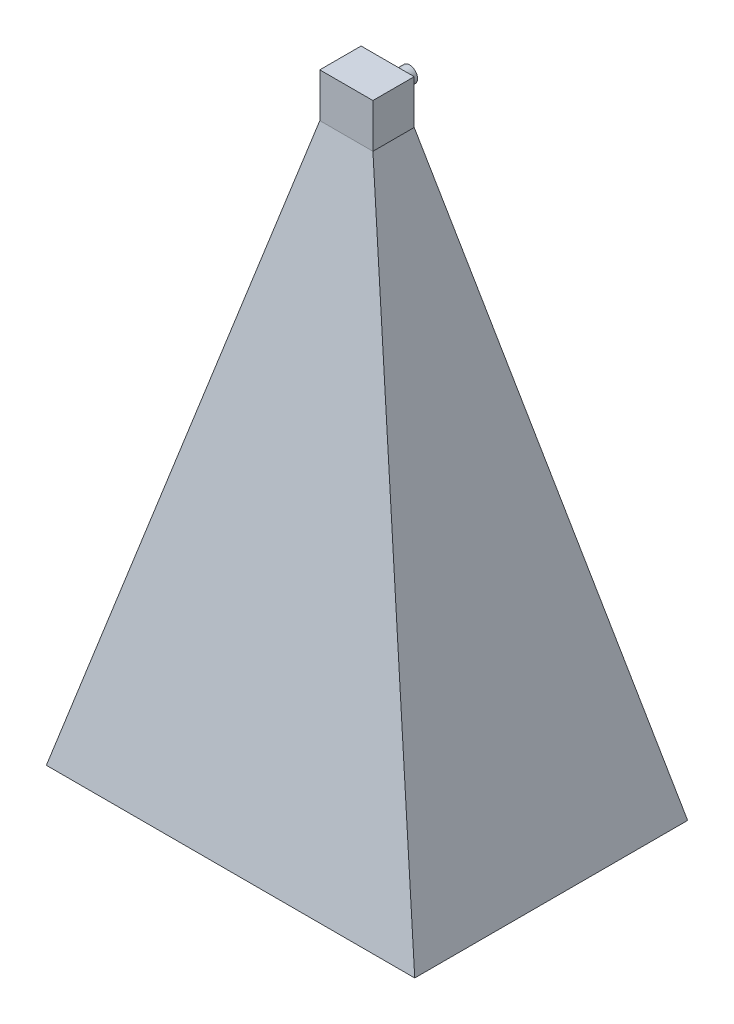
ISO-10303-21;
HEADER;
FILE_DESCRIPTION(('STEP AP214'),'2;1');
FILE_NAME('part.step','',(''),(''),'','','');
FILE_SCHEMA(('AUTOMOTIVE_DESIGN { 1 0 10303 214 1 1 1 1 }'));
ENDSEC;
DATA;
#1=APPLICATION_CONTEXT('core data for automotive mechanical design processes');
#2=APPLICATION_PROTOCOL_DEFINITION('international standard','automotive_design',2000,#1);
#3=PRODUCT_CONTEXT('',#1,'mechanical');
#4=PRODUCT('Part','Part','',(#3));
#5=PRODUCT_RELATED_PRODUCT_CATEGORY('part','',(#4));
#6=PRODUCT_DEFINITION_FORMATION('','',#4);
#7=PRODUCT_DEFINITION_CONTEXT('part definition',#1,'design');
#8=PRODUCT_DEFINITION('design','',#6,#7);
#9=PRODUCT_DEFINITION_SHAPE('','',#8);
#10=(LENGTH_UNIT() NAMED_UNIT(*) SI_UNIT(.MILLI.,.METRE.));
#11=(NAMED_UNIT(*) PLANE_ANGLE_UNIT() SI_UNIT($,.RADIAN.));
#12=(NAMED_UNIT(*) SI_UNIT($,.STERADIAN.) SOLID_ANGLE_UNIT());
#13=UNCERTAINTY_MEASURE_WITH_UNIT(LENGTH_MEASURE(1.E-05),#10,'distance_accuracy_value','');
#14=(GEOMETRIC_REPRESENTATION_CONTEXT(3) GLOBAL_UNCERTAINTY_ASSIGNED_CONTEXT((#13)) GLOBAL_UNIT_ASSIGNED_CONTEXT((#10,
#11,#12)) REPRESENTATION_CONTEXT('',''));
#15=CARTESIAN_POINT('',(0.,0.,0.));
#16=DIRECTION('',(0.,0.,1.));
#17=DIRECTION('',(1.,0.,0.));
#18=AXIS2_PLACEMENT_3D('',#15,#16,#17);
#19=CARTESIAN_POINT('',(-18.109115614425,425.,-14.0797894774487));
#20=DIRECTION('',(0.,0.,1.));
#21=DIRECTION('',(1.,0.,0.));
#22=AXIS2_PLACEMENT_3D('',#19,#20,#21);
#23=PLANE('',#22);
#24=DIRECTION('',(-1.,0.,0.));
#25=VECTOR('',#24,1.);
#26=CARTESIAN_POINT('',(-15.,395.,-14.0797894774487));
#27=LINE('',#26,#25);
#28=CARTESIAN_POINT('',(18.109115614425,395.,-14.0797894774487));
#29=VERTEX_POINT('',#28);
#30=CARTESIAN_POINT('',(-18.109115614425,395.,-14.0797894774487));
#31=VERTEX_POINT('',#30);
#32=EDGE_CURVE('E192',#29,#31,#27,.T.);
#33=ORIENTED_EDGE('',*,*,#32,.T.);
#34=DIRECTION('',(0.,-1.,0.));
#35=VECTOR('',#34,1.);
#36=CARTESIAN_POINT('',(-18.109115614425,425.,-14.0797894774487));
#37=LINE('',#36,#35);
#38=CARTESIAN_POINT('',(-18.109115614425,425.,-14.0797894774487));
#39=VERTEX_POINT('',#38);
#40=EDGE_CURVE('E308',#39,#31,#37,.T.);
#41=ORIENTED_EDGE('',*,*,#40,.F.);
#42=DIRECTION('',(-1.,0.,0.));
#43=VECTOR('',#42,1.);
#44=CARTESIAN_POINT('',(-18.109115614425,425.,-14.0797894774487));
#45=LINE('',#44,#43);
#46=CARTESIAN_POINT('',(18.109115614425,425.,-14.0797894774487));
#47=VERTEX_POINT('',#46);
#48=EDGE_CURVE('E148',#47,#39,#45,.T.);
#49=ORIENTED_EDGE('',*,*,#48,.F.);
#50=DIRECTION('',(0.,-1.,0.));
#51=VECTOR('',#50,1.);
#52=CARTESIAN_POINT('',(18.109115614425,425.,-14.0797894774487));
#53=LINE('',#52,#51);
#54=EDGE_CURVE('E160',#47,#29,#53,.T.);
#55=ORIENTED_EDGE('',*,*,#54,.T.);
#56=EDGE_LOOP('',(#33,#41,#49,#55));
#57=FACE_BOUND('',#56,.T.);
#58=CARTESIAN_POINT('',(0.,410.,-14.0797894774487));
#59=DIRECTION('',(0.,0.,1.));
#60=DIRECTION('',(1.,0.,0.));
#61=AXIS2_PLACEMENT_3D('',#58,#59,#60);
#62=CIRCLE('',#61,5.40260813746257);
#63=CARTESIAN_POINT('',(5.40260813746257,410.,-14.0797894774487));
#64=VERTEX_POINT('',#63);
#65=EDGE_CURVE('E12',#64,#64,#62,.F.);
#66=ORIENTED_EDGE('',*,*,#65,.F.);
#67=EDGE_LOOP('',(#66));
#68=FACE_BOUND('',#67,.T.);
#69=ADVANCED_FACE('F41',(#57,#68),#23,.F.);
#70=CARTESIAN_POINT('',(-122.5,0.,90.));
#71=DIRECTION('',(0.,1.,0.));
#72=DIRECTION('',(0.,0.,1.));
#73=AXIS2_PLACEMENT_3D('',#70,#71,#72);
#74=PLANE('',#73);
#75=DIRECTION('',(0.,0.,1.));
#76=VECTOR('',#75,1.);
#77=CARTESIAN_POINT('',(-125.609115614425,0.,11.0204081632654));
#78=LINE('',#77,#76);
#79=CARTESIAN_POINT('',(-125.609115614425,0.,-93.0593813141834));
#80=VERTEX_POINT('',#79);
#81=CARTESIAN_POINT('',(-125.609115614425,0.,93.0593813141834));
#82=VERTEX_POINT('',#81);
#83=EDGE_CURVE('E187',#80,#82,#78,.T.);
#84=ORIENTED_EDGE('',*,*,#83,.F.);
#85=DIRECTION('',(-1.,0.,0.));
#86=VECTOR('',#85,1.);
#87=CARTESIAN_POINT('',(-15.,0.,-93.0593813141834));
#88=LINE('',#87,#86);
#89=CARTESIAN_POINT('',(125.609115614425,0.,-93.0593813141834));
#90=VERTEX_POINT('',#89);
#91=EDGE_CURVE('E49',#90,#80,#88,.T.);
#92=ORIENTED_EDGE('',*,*,#91,.F.);
#93=DIRECTION('',(0.,0.,-1.));
#94=VECTOR('',#93,1.);
#95=CARTESIAN_POINT('',(125.609115614425,0.,-11.0204081632653));
#96=LINE('',#95,#94);
#97=CARTESIAN_POINT('',(125.609115614425,0.,93.0593813141834));
#98=VERTEX_POINT('',#97);
#99=EDGE_CURVE('E202',#98,#90,#96,.T.);
#100=ORIENTED_EDGE('',*,*,#99,.F.);
#101=DIRECTION('',(1.,0.,0.));
#102=VECTOR('',#101,1.);
#103=CARTESIAN_POINT('',(15.,0.,93.0593813141834));
#104=LINE('',#103,#102);
#105=EDGE_CURVE('E65',#82,#98,#104,.T.);
#106=ORIENTED_EDGE('',*,*,#105,.F.);
#107=EDGE_LOOP('',(#84,#92,#100,#106));
#108=FACE_BOUND('',#107,.T.);
#109=DIRECTION('',(0.,0.,1.));
#110=VECTOR('',#109,1.);
#111=CARTESIAN_POINT('',(-122.5,0.,-90.));
#112=LINE('',#111,#110);
#113=CARTESIAN_POINT('',(-122.5,0.,-90.));
#114=VERTEX_POINT('',#113);
#115=CARTESIAN_POINT('',(-122.5,0.,90.));
#116=VERTEX_POINT('',#115);
#117=EDGE_CURVE('E167',#114,#116,#112,.T.);
#118=ORIENTED_EDGE('',*,*,#117,.T.);
#119=DIRECTION('',(1.,0.,0.));
#120=VECTOR('',#119,1.);
#121=CARTESIAN_POINT('',(-122.5,0.,90.));
#122=LINE('',#121,#120);
#123=CARTESIAN_POINT('',(122.5,0.,90.));
#124=VERTEX_POINT('',#123);
#125=EDGE_CURVE('E98',#116,#124,#122,.T.);
#126=ORIENTED_EDGE('',*,*,#125,.T.);
#127=DIRECTION('',(0.,0.,-1.));
#128=VECTOR('',#127,1.);
#129=CARTESIAN_POINT('',(122.5,0.,-90.));
#130=LINE('',#129,#128);
#131=CARTESIAN_POINT('',(122.5,0.,-90.));
#132=VERTEX_POINT('',#131);
#133=EDGE_CURVE('E208',#124,#132,#130,.T.);
#134=ORIENTED_EDGE('',*,*,#133,.T.);
#135=DIRECTION('',(-1.,0.,0.));
#136=VECTOR('',#135,1.);
#137=CARTESIAN_POINT('',(-122.5,0.,-90.));
#138=LINE('',#137,#136);
#139=EDGE_CURVE('E200',#132,#114,#138,.T.);
#140=ORIENTED_EDGE('',*,*,#139,.T.);
#141=EDGE_LOOP('',(#118,#126,#134,#140));
#142=FACE_BOUND('',#141,.T.);
#143=ADVANCED_FACE('F245',(#108,#142),#74,.F.);
#144=CARTESIAN_POINT('',(-15.,395.588202260219,-13.9621794156017));
#145=DIRECTION('',(0.,-0.196067420073056,0.980590417445477));
#146=DIRECTION('',(0.,-0.980590417445478,-0.196067420073056));
#147=AXIS2_PLACEMENT_3D('',#144,#145,#146);
#148=PLANE('',#147);
#149=DIRECTION('',(0.257845649597896,0.947432852010875,0.18943762011274));
#150=VECTOR('',#149,1.);
#151=CARTESIAN_POINT('',(-17.7529704750085,396.308626326228,-13.8181318239998));
#152=LINE('',#151,#150);
#153=EDGE_CURVE('E76',#80,#31,#152,.T.);
#154=ORIENTED_EDGE('',*,*,#153,.T.);
#155=ORIENTED_EDGE('',*,*,#32,.F.);
#156=DIRECTION('',(-0.257845649597896,0.947432852010875,0.18943762011274));
#157=VECTOR('',#156,1.);
#158=CARTESIAN_POINT('',(17.7529704750085,396.308626326228,-13.8181318239998));
#159=LINE('',#158,#157);
#160=EDGE_CURVE('E184',#90,#29,#159,.T.);
#161=ORIENTED_EDGE('',*,*,#160,.F.);
#162=ORIENTED_EDGE('',*,*,#91,.T.);
#163=EDGE_LOOP('',(#154,#155,#161,#162));
#164=FACE_BOUND('',#163,.T.);
#165=ADVANCED_FACE('F263',(#164),#148,.F.);
#166=CARTESIAN_POINT('',(17.8947138402456,395.787801867915,-11.0204081632653));
#167=DIRECTION('',(-0.964904613415216,-0.262600622638318,0.));
#168=DIRECTION('',(0.262600622638318,-0.964904613415216,0.));
#169=AXIS2_PLACEMENT_3D('',#166,#167,#168);
#170=PLANE('',#169);
#171=ORIENTED_EDGE('',*,*,#160,.T.);
#172=DIRECTION('',(0.,0.,-1.));
#173=VECTOR('',#172,1.);
#174=CARTESIAN_POINT('',(18.109115614425,395.,-11.0204081632653));
#175=LINE('',#174,#173);
#176=CARTESIAN_POINT('',(18.109115614425,395.,14.0797894774488));
#177=VERTEX_POINT('',#176);
#178=EDGE_CURVE('E195',#177,#29,#175,.T.);
#179=ORIENTED_EDGE('',*,*,#178,.F.);
#180=DIRECTION('',(-0.257845649597896,0.947432852010875,-0.18943762011274));
#181=VECTOR('',#180,1.);
#182=CARTESIAN_POINT('',(17.7529704750085,396.308626326228,13.8181318239998));
#183=LINE('',#182,#181);
#184=EDGE_CURVE('E188',#98,#177,#183,.T.);
#185=ORIENTED_EDGE('',*,*,#184,.F.);
#186=ORIENTED_EDGE('',*,*,#99,.T.);
#187=EDGE_LOOP('',(#171,#179,#185,#186));
#188=FACE_BOUND('',#187,.T.);
#189=ADVANCED_FACE('F286',(#188),#170,.F.);
#190=CARTESIAN_POINT('',(-17.8947138402456,395.787801867915,11.0204081632654));
#191=DIRECTION('',(0.964904613415216,-0.262600622638318,0.));
#192=DIRECTION('',(0.262600622638318,0.964904613415216,0.));
#193=AXIS2_PLACEMENT_3D('',#190,#191,#192);
#194=PLANE('',#193);
#195=DIRECTION('',(0.257845649597896,0.947432852010875,-0.18943762011274));
#196=VECTOR('',#195,1.);
#197=CARTESIAN_POINT('',(-17.7529704750085,396.308626326228,13.8181318239998));
#198=LINE('',#197,#196);
#199=CARTESIAN_POINT('',(-18.109115614425,395.,14.0797894774488));
#200=VERTEX_POINT('',#199);
#201=EDGE_CURVE('E93',#82,#200,#198,.T.);
#202=ORIENTED_EDGE('',*,*,#201,.T.);
#203=DIRECTION('',(0.,0.,1.));
#204=VECTOR('',#203,1.);
#205=CARTESIAN_POINT('',(-18.109115614425,395.,11.0204081632654));
#206=LINE('',#205,#204);
#207=EDGE_CURVE('E83',#31,#200,#206,.T.);
#208=ORIENTED_EDGE('',*,*,#207,.F.);
#209=ORIENTED_EDGE('',*,*,#153,.F.);
#210=ORIENTED_EDGE('',*,*,#83,.T.);
#211=EDGE_LOOP('',(#202,#208,#209,#210));
#212=FACE_BOUND('',#211,.T.);
#213=ADVANCED_FACE('F292',(#212),#194,.F.);
#214=CARTESIAN_POINT('',(15.,395.588202260219,13.9621794156018));
#215=DIRECTION('',(0.,-0.196067420073056,-0.980590417445477));
#216=DIRECTION('',(0.,0.980590417445478,-0.196067420073056));
#217=AXIS2_PLACEMENT_3D('',#214,#215,#216);
#218=PLANE('',#217);
#219=ORIENTED_EDGE('',*,*,#184,.T.);
#220=DIRECTION('',(1.,0.,0.));
#221=VECTOR('',#220,1.);
#222=CARTESIAN_POINT('',(15.,395.,14.0797894774488));
#223=LINE('',#222,#221);
#224=EDGE_CURVE('E190',#200,#177,#223,.T.);
#225=ORIENTED_EDGE('',*,*,#224,.F.);
#226=ORIENTED_EDGE('',*,*,#201,.F.);
#227=ORIENTED_EDGE('',*,*,#105,.T.);
#228=EDGE_LOOP('',(#219,#225,#226,#227));
#229=FACE_BOUND('',#228,.T.);
#230=ADVANCED_FACE('F43',(#229),#218,.F.);
#231=CARTESIAN_POINT('',(-15.,395.,-11.0204081632653));
#232=DIRECTION('',(0.,-0.196067420073056,0.980590417445477));
#233=DIRECTION('',(0.,-0.980590417445478,-0.196067420073056));
#234=AXIS2_PLACEMENT_3D('',#231,#232,#233);
#235=PLANE('',#234);
#236=DIRECTION('',(0.257845649597896,0.947432852010875,0.18943762011274));
#237=VECTOR('',#236,1.);
#238=CARTESIAN_POINT('',(-122.5,0.,-90.));
#239=LINE('',#238,#237);
#240=CARTESIAN_POINT('',(-15.,395.,-11.0204081632653));
#241=VERTEX_POINT('',#240);
#242=EDGE_CURVE('E168',#114,#241,#239,.T.);
#243=ORIENTED_EDGE('',*,*,#242,.F.);
#244=ORIENTED_EDGE('',*,*,#139,.F.);
#245=DIRECTION('',(-0.257845649597896,0.947432852010875,0.18943762011274));
#246=VECTOR('',#245,1.);
#247=CARTESIAN_POINT('',(122.5,0.,-90.));
#248=LINE('',#247,#246);
#249=CARTESIAN_POINT('',(15.,395.,-11.0204081632653));
#250=VERTEX_POINT('',#249);
#251=EDGE_CURVE('E164',#132,#250,#248,.T.);
#252=ORIENTED_EDGE('',*,*,#251,.T.);
#253=DIRECTION('',(-1.,0.,0.));
#254=VECTOR('',#253,1.);
#255=CARTESIAN_POINT('',(15.,395.,-11.0204081632653));
#256=LINE('',#255,#254);
#257=EDGE_CURVE('E158',#250,#241,#256,.T.);
#258=ORIENTED_EDGE('',*,*,#257,.T.);
#259=EDGE_LOOP('',(#243,#244,#252,#258));
#260=FACE_BOUND('',#259,.T.);
#261=ADVANCED_FACE('F236',(#260),#235,.T.);
#262=CARTESIAN_POINT('',(15.,395.,-11.0204081632653));
#263=DIRECTION('',(-0.964904613415216,-0.262600622638318,0.));
#264=DIRECTION('',(0.262600622638318,-0.964904613415216,0.));
#265=AXIS2_PLACEMENT_3D('',#262,#263,#264);
#266=PLANE('',#265);
#267=ORIENTED_EDGE('',*,*,#251,.F.);
#268=ORIENTED_EDGE('',*,*,#133,.F.);
#269=DIRECTION('',(-0.257845649597896,0.947432852010875,-0.18943762011274));
#270=VECTOR('',#269,1.);
#271=CARTESIAN_POINT('',(122.5,0.,90.));
#272=LINE('',#271,#270);
#273=CARTESIAN_POINT('',(15.,395.,11.0204081632653));
#274=VERTEX_POINT('',#273);
#275=EDGE_CURVE('E56',#124,#274,#272,.T.);
#276=ORIENTED_EDGE('',*,*,#275,.T.);
#277=DIRECTION('',(0.,0.,-1.));
#278=VECTOR('',#277,1.);
#279=CARTESIAN_POINT('',(15.,395.,11.0204081632653));
#280=LINE('',#279,#278);
#281=EDGE_CURVE('E155',#274,#250,#280,.T.);
#282=ORIENTED_EDGE('',*,*,#281,.T.);
#283=EDGE_LOOP('',(#267,#268,#276,#282));
#284=FACE_BOUND('',#283,.T.);
#285=ADVANCED_FACE('F247',(#284),#266,.T.);
#286=CARTESIAN_POINT('',(-15.,395.,11.0204081632654));
#287=DIRECTION('',(0.964904613415216,-0.262600622638318,0.));
#288=DIRECTION('',(0.262600622638318,0.964904613415216,0.));
#289=AXIS2_PLACEMENT_3D('',#286,#287,#288);
#290=PLANE('',#289);
#291=DIRECTION('',(0.257845649597896,0.947432852010875,-0.18943762011274));
#292=VECTOR('',#291,1.);
#293=CARTESIAN_POINT('',(-122.5,0.,90.));
#294=LINE('',#293,#292);
#295=CARTESIAN_POINT('',(-15.,395.,11.0204081632653));
#296=VERTEX_POINT('',#295);
#297=EDGE_CURVE('E173',#116,#296,#294,.T.);
#298=ORIENTED_EDGE('',*,*,#297,.F.);
#299=ORIENTED_EDGE('',*,*,#117,.F.);
#300=ORIENTED_EDGE('',*,*,#242,.T.);
#301=DIRECTION('',(0.,0.,1.));
#302=VECTOR('',#301,1.);
#303=CARTESIAN_POINT('',(-15.,395.,11.0204081632654));
#304=LINE('',#303,#302);
#305=EDGE_CURVE('E224',#241,#296,#304,.T.);
#306=ORIENTED_EDGE('',*,*,#305,.T.);
#307=EDGE_LOOP('',(#298,#299,#300,#306));
#308=FACE_BOUND('',#307,.T.);
#309=ADVANCED_FACE('F243',(#308),#290,.T.);
#310=CARTESIAN_POINT('',(15.,395.,11.0204081632653));
#311=DIRECTION('',(0.,-0.196067420073056,-0.980590417445477));
#312=DIRECTION('',(0.,0.980590417445478,-0.196067420073056));
#313=AXIS2_PLACEMENT_3D('',#310,#311,#312);
#314=PLANE('',#313);
#315=ORIENTED_EDGE('',*,*,#275,.F.);
#316=ORIENTED_EDGE('',*,*,#125,.F.);
#317=ORIENTED_EDGE('',*,*,#297,.T.);
#318=DIRECTION('',(1.,0.,0.));
#319=VECTOR('',#318,1.);
#320=CARTESIAN_POINT('',(15.,395.,11.0204081632653));
#321=LINE('',#320,#319);
#322=EDGE_CURVE('E180',#296,#274,#321,.T.);
#323=ORIENTED_EDGE('',*,*,#322,.T.);
#324=EDGE_LOOP('',(#315,#316,#317,#323));
#325=FACE_BOUND('',#324,.T.);
#326=ADVANCED_FACE('F254',(#325),#314,.T.);
#327=CARTESIAN_POINT('',(-18.109115614425,395.,14.0797894774488));
#328=DIRECTION('',(0.,1.,0.));
#329=DIRECTION('',(0.,0.,1.));
#330=AXIS2_PLACEMENT_3D('',#327,#328,#329);
#331=PLANE('',#330);
#332=ORIENTED_EDGE('',*,*,#257,.F.);
#333=ORIENTED_EDGE('',*,*,#281,.F.);
#334=ORIENTED_EDGE('',*,*,#322,.F.);
#335=ORIENTED_EDGE('',*,*,#305,.F.);
#336=EDGE_LOOP('',(#332,#333,#334,#335));
#337=FACE_BOUND('',#336,.T.);
#338=ADVANCED_FACE('F241',(#337),#331,.F.);
#339=CARTESIAN_POINT('',(-18.109115614425,425.,-14.0797894774487));
#340=DIRECTION('',(1.,0.,0.));
#341=DIRECTION('',(0.,0.,-1.));
#342=AXIS2_PLACEMENT_3D('',#339,#340,#341);
#343=PLANE('',#342);
#344=ORIENTED_EDGE('',*,*,#207,.T.);
#345=DIRECTION('',(0.,-1.,0.));
#346=VECTOR('',#345,1.);
#347=CARTESIAN_POINT('',(-18.109115614425,425.,14.0797894774488));
#348=LINE('',#347,#346);
#349=CARTESIAN_POINT('',(-18.109115614425,425.,14.0797894774488));
#350=VERTEX_POINT('',#349);
#351=EDGE_CURVE('E137',#350,#200,#348,.T.);
#352=ORIENTED_EDGE('',*,*,#351,.F.);
#353=DIRECTION('',(0.,0.,1.));
#354=VECTOR('',#353,1.);
#355=CARTESIAN_POINT('',(-18.109115614425,425.,-14.0797894774487));
#356=LINE('',#355,#354);
#357=EDGE_CURVE('E143',#39,#350,#356,.T.);
#358=ORIENTED_EDGE('',*,*,#357,.F.);
#359=ORIENTED_EDGE('',*,*,#40,.T.);
#360=EDGE_LOOP('',(#344,#352,#358,#359));
#361=FACE_BOUND('',#360,.T.);
#362=ADVANCED_FACE('F154',(#361),#343,.F.);
#363=CARTESIAN_POINT('',(-18.109115614425,425.,14.0797894774488));
#364=DIRECTION('',(0.,0.,-1.));
#365=DIRECTION('',(-1.,0.,0.));
#366=AXIS2_PLACEMENT_3D('',#363,#364,#365);
#367=PLANE('',#366);
#368=ORIENTED_EDGE('',*,*,#224,.T.);
#369=DIRECTION('',(0.,-1.,0.));
#370=VECTOR('',#369,1.);
#371=CARTESIAN_POINT('',(18.109115614425,425.,14.0797894774488));
#372=LINE('',#371,#370);
#373=CARTESIAN_POINT('',(18.109115614425,425.,14.0797894774488));
#374=VERTEX_POINT('',#373);
#375=EDGE_CURVE('E139',#374,#177,#372,.T.);
#376=ORIENTED_EDGE('',*,*,#375,.F.);
#377=DIRECTION('',(1.,0.,0.));
#378=VECTOR('',#377,1.);
#379=CARTESIAN_POINT('',(-18.109115614425,425.,14.0797894774488));
#380=LINE('',#379,#378);
#381=EDGE_CURVE('E132',#350,#374,#380,.T.);
#382=ORIENTED_EDGE('',*,*,#381,.F.);
#383=ORIENTED_EDGE('',*,*,#351,.T.);
#384=EDGE_LOOP('',(#368,#376,#382,#383));
#385=FACE_BOUND('',#384,.T.);
#386=ADVANCED_FACE('F135',(#385),#367,.F.);
#387=CARTESIAN_POINT('',(18.109115614425,425.,-14.0797894774487));
#388=DIRECTION('',(-1.,0.,0.));
#389=DIRECTION('',(0.,0.,1.));
#390=AXIS2_PLACEMENT_3D('',#387,#388,#389);
#391=PLANE('',#390);
#392=ORIENTED_EDGE('',*,*,#178,.T.);
#393=ORIENTED_EDGE('',*,*,#54,.F.);
#394=DIRECTION('',(0.,0.,-1.));
#395=VECTOR('',#394,1.);
#396=CARTESIAN_POINT('',(18.109115614425,425.,-14.0797894774487));
#397=LINE('',#396,#395);
#398=EDGE_CURVE('E142',#374,#47,#397,.T.);
#399=ORIENTED_EDGE('',*,*,#398,.F.);
#400=ORIENTED_EDGE('',*,*,#375,.T.);
#401=EDGE_LOOP('',(#392,#393,#399,#400));
#402=FACE_BOUND('',#401,.T.);
#403=ADVANCED_FACE('F269',(#402),#391,.F.);
#404=CARTESIAN_POINT('',(-18.109115614425,425.,14.0797894774488));
#405=DIRECTION('',(0.,1.,0.));
#406=DIRECTION('',(0.,0.,1.));
#407=AXIS2_PLACEMENT_3D('',#404,#405,#406);
#408=PLANE('',#407);
#409=ORIENTED_EDGE('',*,*,#357,.T.);
#410=ORIENTED_EDGE('',*,*,#381,.T.);
#411=ORIENTED_EDGE('',*,*,#398,.T.);
#412=ORIENTED_EDGE('',*,*,#48,.T.);
#413=EDGE_LOOP('',(#409,#410,#411,#412));
#414=FACE_BOUND('',#413,.T.);
#415=ADVANCED_FACE('F146',(#414),#408,.T.);
#416=CARTESIAN_POINT('',(0.,410.,-29.0797894774487));
#417=DIRECTION('',(0.,0.,1.));
#418=DIRECTION('',(1.,0.,0.));
#419=AXIS2_PLACEMENT_3D('',#416,#417,#418);
#420=CYLINDRICAL_SURFACE('',#419,5.40260813746257);
#421=CARTESIAN_POINT('',(0.,410.,-29.0797894774487));
#422=DIRECTION('',(0.,0.,-1.));
#423=DIRECTION('',(-1.,0.,0.));
#424=AXIS2_PLACEMENT_3D('',#421,#422,#423);
#425=CIRCLE('',#424,5.40260813746257);
#426=CARTESIAN_POINT('',(-5.40260813746257,410.,-29.0797894774487));
#427=VERTEX_POINT('',#426);
#428=EDGE_CURVE('E152',#427,#427,#425,.T.);
#429=ORIENTED_EDGE('',*,*,#428,.F.);
#430=EDGE_LOOP('',(#429));
#431=FACE_BOUND('',#430,.T.);
#432=ORIENTED_EDGE('',*,*,#65,.T.);
#433=EDGE_LOOP('',(#432));
#434=FACE_BOUND('',#433,.T.);
#435=ADVANCED_FACE('F317',(#431,#434),#420,.T.);
#436=CARTESIAN_POINT('',(0.,410.,-29.0797894774487));
#437=DIRECTION('',(0.,0.,-1.));
#438=DIRECTION('',(-1.,0.,0.));
#439=AXIS2_PLACEMENT_3D('',#436,#437,#438);
#440=PLANE('',#439);
#441=ORIENTED_EDGE('',*,*,#428,.T.);
#442=EDGE_LOOP('',(#441));
#443=FACE_BOUND('',#442,.T.);
#444=ADVANCED_FACE('F315',(#443),#440,.T.);
#445=CLOSED_SHELL('',(#69,#143,#165,#189,#213,#230,#261,#285,#309,#326,#338,#362,#386,#403,#415,
#435,#444));
#446=MANIFOLD_SOLID_BREP('B2',#445);
#447=ADVANCED_BREP_SHAPE_REPRESENTATION('',(#18,#446),#14);
#448=SHAPE_DEFINITION_REPRESENTATION(#9,#447);
ENDSEC;
END-ISO-10303-21;
